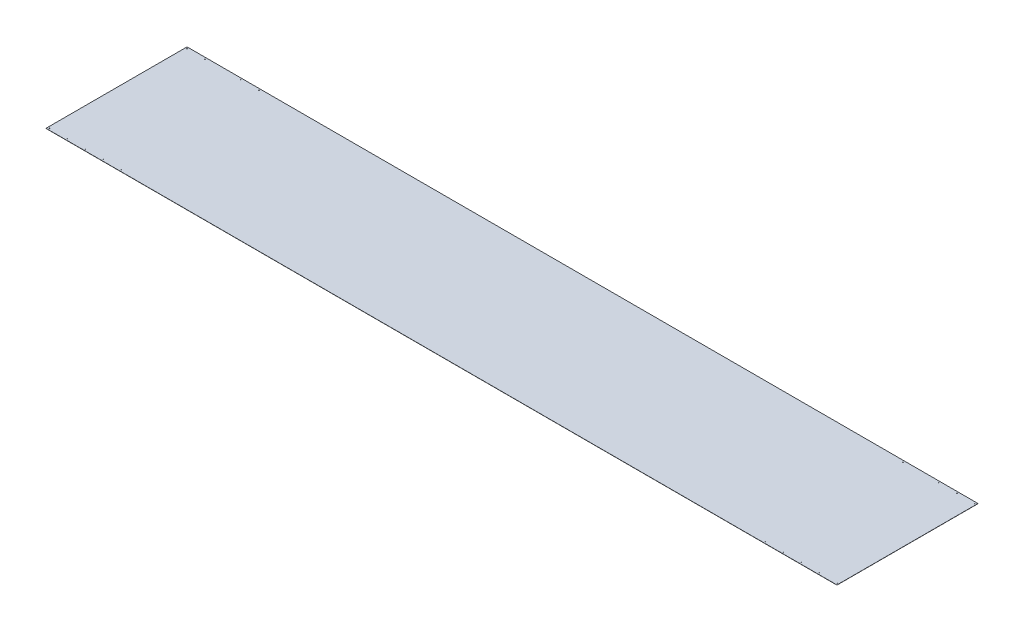
ISO-10303-21;
HEADER;
FILE_DESCRIPTION(('STEP AP214'),'2;1');
FILE_NAME('part.step','',(''),(''),'','','');
FILE_SCHEMA(('AUTOMOTIVE_DESIGN { 1 0 10303 214 1 1 1 1 }'));
ENDSEC;
DATA;
#1=APPLICATION_CONTEXT('core data for automotive mechanical design processes');
#2=APPLICATION_PROTOCOL_DEFINITION('international standard','automotive_design',2000,#1);
#3=PRODUCT_CONTEXT('',#1,'mechanical');
#4=PRODUCT('Part','Part','',(#3));
#5=PRODUCT_RELATED_PRODUCT_CATEGORY('part','',(#4));
#6=PRODUCT_DEFINITION_FORMATION('','',#4);
#7=PRODUCT_DEFINITION_CONTEXT('part definition',#1,'design');
#8=PRODUCT_DEFINITION('design','',#6,#7);
#9=PRODUCT_DEFINITION_SHAPE('','',#8);
#10=(LENGTH_UNIT() NAMED_UNIT(*) SI_UNIT(.MILLI.,.METRE.));
#11=(NAMED_UNIT(*) PLANE_ANGLE_UNIT() SI_UNIT($,.RADIAN.));
#12=(NAMED_UNIT(*) SI_UNIT($,.STERADIAN.) SOLID_ANGLE_UNIT());
#13=UNCERTAINTY_MEASURE_WITH_UNIT(LENGTH_MEASURE(1.E-05),#10,'distance_accuracy_value','');
#14=(GEOMETRIC_REPRESENTATION_CONTEXT(3) GLOBAL_UNCERTAINTY_ASSIGNED_CONTEXT((#13)) GLOBAL_UNIT_ASSIGNED_CONTEXT((#10,
#11,#12)) REPRESENTATION_CONTEXT('',''));
#15=CARTESIAN_POINT('',(0.,0.,0.));
#16=DIRECTION('',(0.,0.,1.));
#17=DIRECTION('',(1.,0.,0.));
#18=AXIS2_PLACEMENT_3D('',#15,#16,#17);
#19=CARTESIAN_POINT('',(-4679.25,2.,834.500000000001));
#20=DIRECTION('',(1.,0.,0.));
#21=DIRECTION('',(0.,0.,-1.));
#22=AXIS2_PLACEMENT_3D('',#19,#20,#21);
#23=PLANE('',#22);
#24=DIRECTION('',(0.,0.,1.));
#25=VECTOR('',#24,1.);
#26=CARTESIAN_POINT('',(-4679.25,0.,834.500000000001));
#27=LINE('',#26,#25);
#28=CARTESIAN_POINT('',(-4679.25,0.,-834.499999999999));
#29=VERTEX_POINT('',#28);
#30=CARTESIAN_POINT('',(-4679.25,0.,834.500000000001));
#31=VERTEX_POINT('',#30);
#32=EDGE_CURVE('E99',#29,#31,#27,.T.);
#33=ORIENTED_EDGE('',*,*,#32,.T.);
#34=DIRECTION('',(0.,-1.,0.));
#35=VECTOR('',#34,1.);
#36=CARTESIAN_POINT('',(-4679.25,2.,834.500000000001));
#37=LINE('',#36,#35);
#38=CARTESIAN_POINT('',(-4679.25,2.,834.500000000001));
#39=VERTEX_POINT('',#38);
#40=EDGE_CURVE('E11',#39,#31,#37,.T.);
#41=ORIENTED_EDGE('',*,*,#40,.F.);
#42=DIRECTION('',(0.,0.,1.));
#43=VECTOR('',#42,1.);
#44=CARTESIAN_POINT('',(-4679.25,2.,834.500000000001));
#45=LINE('',#44,#43);
#46=CARTESIAN_POINT('',(-4679.25,2.,-834.499999999999));
#47=VERTEX_POINT('',#46);
#48=EDGE_CURVE('E86',#47,#39,#45,.T.);
#49=ORIENTED_EDGE('',*,*,#48,.F.);
#50=DIRECTION('',(0.,-1.,0.));
#51=VECTOR('',#50,1.);
#52=CARTESIAN_POINT('',(-4679.25,2.,-834.499999999999));
#53=LINE('',#52,#51);
#54=EDGE_CURVE('E95',#47,#29,#53,.T.);
#55=ORIENTED_EDGE('',*,*,#54,.T.);
#56=EDGE_LOOP('',(#33,#41,#49,#55));
#57=FACE_BOUND('',#56,.T.);
#58=ADVANCED_FACE('F33',(#57),#23,.F.);
#59=CARTESIAN_POINT('',(4679.25,2.,834.5));
#60=DIRECTION('',(0.,0.,-1.));
#61=DIRECTION('',(-1.,0.,0.));
#62=AXIS2_PLACEMENT_3D('',#59,#60,#61);
#63=PLANE('',#62);
#64=DIRECTION('',(1.,0.,0.));
#65=VECTOR('',#64,1.);
#66=CARTESIAN_POINT('',(4679.25,0.,834.5));
#67=LINE('',#66,#65);
#68=CARTESIAN_POINT('',(4679.25,0.,834.5));
#69=VERTEX_POINT('',#68);
#70=EDGE_CURVE('E90',#31,#69,#67,.T.);
#71=ORIENTED_EDGE('',*,*,#70,.T.);
#72=DIRECTION('',(0.,-1.,0.));
#73=VECTOR('',#72,1.);
#74=CARTESIAN_POINT('',(4679.25,2.,834.5));
#75=LINE('',#74,#73);
#76=CARTESIAN_POINT('',(4679.25,2.,834.5));
#77=VERTEX_POINT('',#76);
#78=EDGE_CURVE('E42',#77,#69,#75,.T.);
#79=ORIENTED_EDGE('',*,*,#78,.F.);
#80=DIRECTION('',(1.,0.,0.));
#81=VECTOR('',#80,1.);
#82=CARTESIAN_POINT('',(4679.25,2.,834.5));
#83=LINE('',#82,#81);
#84=EDGE_CURVE('E81',#39,#77,#83,.T.);
#85=ORIENTED_EDGE('',*,*,#84,.F.);
#86=ORIENTED_EDGE('',*,*,#40,.T.);
#87=EDGE_LOOP('',(#71,#79,#85,#86));
#88=FACE_BOUND('',#87,.T.);
#89=ADVANCED_FACE('F89',(#88),#63,.F.);
#90=CARTESIAN_POINT('',(4679.25,2.,834.5));
#91=DIRECTION('',(-1.,0.,0.));
#92=DIRECTION('',(0.,0.,1.));
#93=AXIS2_PLACEMENT_3D('',#90,#91,#92);
#94=PLANE('',#93);
#95=DIRECTION('',(0.,0.,-1.));
#96=VECTOR('',#95,1.);
#97=CARTESIAN_POINT('',(4679.25,0.,834.5));
#98=LINE('',#97,#96);
#99=CARTESIAN_POINT('',(4679.25,0.,-834.5));
#100=VERTEX_POINT('',#99);
#101=EDGE_CURVE('E68',#69,#100,#98,.T.);
#102=ORIENTED_EDGE('',*,*,#101,.T.);
#103=DIRECTION('',(0.,-1.,0.));
#104=VECTOR('',#103,1.);
#105=CARTESIAN_POINT('',(4679.25,2.,-834.5));
#106=LINE('',#105,#104);
#107=CARTESIAN_POINT('',(4679.25,2.,-834.5));
#108=VERTEX_POINT('',#107);
#109=EDGE_CURVE('E91',#108,#100,#106,.T.);
#110=ORIENTED_EDGE('',*,*,#109,.F.);
#111=DIRECTION('',(0.,0.,-1.));
#112=VECTOR('',#111,1.);
#113=CARTESIAN_POINT('',(4679.25,2.,834.5));
#114=LINE('',#113,#112);
#115=EDGE_CURVE('E84',#77,#108,#114,.T.);
#116=ORIENTED_EDGE('',*,*,#115,.F.);
#117=ORIENTED_EDGE('',*,*,#78,.T.);
#118=EDGE_LOOP('',(#102,#110,#116,#117));
#119=FACE_BOUND('',#118,.T.);
#120=ADVANCED_FACE('F93',(#119),#94,.F.);
#121=CARTESIAN_POINT('',(4679.25,2.,-834.5));
#122=DIRECTION('',(0.,0.,1.));
#123=DIRECTION('',(1.,0.,0.));
#124=AXIS2_PLACEMENT_3D('',#121,#122,#123);
#125=PLANE('',#124);
#126=DIRECTION('',(-1.,0.,0.));
#127=VECTOR('',#126,1.);
#128=CARTESIAN_POINT('',(4679.25,0.,-834.5));
#129=LINE('',#128,#127);
#130=EDGE_CURVE('E74',#100,#29,#129,.T.);
#131=ORIENTED_EDGE('',*,*,#130,.T.);
#132=ORIENTED_EDGE('',*,*,#54,.F.);
#133=DIRECTION('',(-1.,0.,0.));
#134=VECTOR('',#133,1.);
#135=CARTESIAN_POINT('',(4679.25,2.,-834.5));
#136=LINE('',#135,#134);
#137=EDGE_CURVE('E51',#108,#47,#136,.T.);
#138=ORIENTED_EDGE('',*,*,#137,.F.);
#139=ORIENTED_EDGE('',*,*,#109,.T.);
#140=EDGE_LOOP('',(#131,#132,#138,#139));
#141=FACE_BOUND('',#140,.T.);
#142=ADVANCED_FACE('F200',(#141),#125,.F.);
#143=CARTESIAN_POINT('',(0.,2.,0.));
#144=DIRECTION('',(0.,1.,0.));
#145=DIRECTION('',(0.,0.,1.));
#146=AXIS2_PLACEMENT_3D('',#143,#144,#145);
#147=PLANE('',#146);
#148=CARTESIAN_POINT('',(4449.75,2.,-814.499999999999));
#149=DIRECTION('',(0.,1.,0.));
#150=DIRECTION('',(0.,0.,1.));
#151=AXIS2_PLACEMENT_3D('',#148,#149,#150);
#152=CIRCLE('',#151,3.24999999999927);
#153=CARTESIAN_POINT('',(4449.75,2.,-811.25));
#154=VERTEX_POINT('',#153);
#155=EDGE_CURVE('E475',#154,#154,#152,.T.);
#156=ORIENTED_EDGE('',*,*,#155,.F.);
#157=EDGE_LOOP('',(#156));
#158=FACE_BOUND('',#157,.T.);
#159=CARTESIAN_POINT('',(4662.25,2.,814.500000000001));
#160=DIRECTION('',(0.,1.,0.));
#161=DIRECTION('',(0.,0.,1.));
#162=AXIS2_PLACEMENT_3D('',#159,#160,#161);
#163=CIRCLE('',#162,3.24999999999927);
#164=CARTESIAN_POINT('',(4662.25,2.,817.75));
#165=VERTEX_POINT('',#164);
#166=EDGE_CURVE('E469',#165,#165,#163,.T.);
#167=ORIENTED_EDGE('',*,*,#166,.F.);
#168=EDGE_LOOP('',(#167));
#169=FACE_BOUND('',#168,.T.);
#170=CARTESIAN_POINT('',(4662.25,2.,-814.5));
#171=DIRECTION('',(0.,1.,0.));
#172=DIRECTION('',(0.,0.,1.));
#173=AXIS2_PLACEMENT_3D('',#170,#171,#172);
#174=CIRCLE('',#173,3.24999999999927);
#175=CARTESIAN_POINT('',(4662.25,2.,-811.250000000001));
#176=VERTEX_POINT('',#175);
#177=EDGE_CURVE('E413',#176,#176,#174,.T.);
#178=ORIENTED_EDGE('',*,*,#177,.F.);
#179=EDGE_LOOP('',(#178));
#180=FACE_BOUND('',#179,.T.);
#181=CARTESIAN_POINT('',(-3809.25,2.,814.500000000001));
#182=DIRECTION('',(0.,1.,0.));
#183=DIRECTION('',(0.,0.,1.));
#184=AXIS2_PLACEMENT_3D('',#181,#182,#183);
#185=CIRCLE('',#184,3.24999999999924);
#186=CARTESIAN_POINT('',(-3809.25,2.,817.75));
#187=VERTEX_POINT('',#186);
#188=EDGE_CURVE('E468',#187,#187,#185,.T.);
#189=ORIENTED_EDGE('',*,*,#188,.F.);
#190=EDGE_LOOP('',(#189));
#191=FACE_BOUND('',#190,.T.);
#192=CARTESIAN_POINT('',(4024.75,2.,-814.499999999996));
#193=DIRECTION('',(0.,1.,0.));
#194=DIRECTION('',(0.,0.,1.));
#195=AXIS2_PLACEMENT_3D('',#192,#193,#194);
#196=CIRCLE('',#195,3.24999999999927);
#197=CARTESIAN_POINT('',(4024.75,2.,-811.249999999997));
#198=VERTEX_POINT('',#197);
#199=EDGE_CURVE('E529',#198,#198,#196,.T.);
#200=ORIENTED_EDGE('',*,*,#199,.F.);
#201=EDGE_LOOP('',(#200));
#202=FACE_BOUND('',#201,.T.);
#203=CARTESIAN_POINT('',(4237.25,2.,814.500000000004));
#204=DIRECTION('',(0.,1.,0.));
#205=DIRECTION('',(0.,0.,1.));
#206=AXIS2_PLACEMENT_3D('',#203,#204,#205);
#207=CIRCLE('',#206,3.24999999999927);
#208=CARTESIAN_POINT('',(4237.25,2.,817.750000000003));
#209=VERTEX_POINT('',#208);
#210=EDGE_CURVE('E532',#209,#209,#207,.T.);
#211=ORIENTED_EDGE('',*,*,#210,.F.);
#212=EDGE_LOOP('',(#211));
#213=FACE_BOUND('',#212,.T.);
#214=CARTESIAN_POINT('',(4237.25,2.,-814.499999999997));
#215=DIRECTION('',(0.,1.,0.));
#216=DIRECTION('',(0.,0.,1.));
#217=AXIS2_PLACEMENT_3D('',#214,#215,#216);
#218=CIRCLE('',#217,3.24999999999927);
#219=CARTESIAN_POINT('',(4237.25,2.,-811.249999999998));
#220=VERTEX_POINT('',#219);
#221=EDGE_CURVE('E538',#220,#220,#218,.T.);
#222=ORIENTED_EDGE('',*,*,#221,.F.);
#223=EDGE_LOOP('',(#222));
#224=FACE_BOUND('',#223,.T.);
#225=CARTESIAN_POINT('',(4449.75,2.,814.500000000002));
#226=DIRECTION('',(0.,1.,0.));
#227=DIRECTION('',(0.,0.,1.));
#228=AXIS2_PLACEMENT_3D('',#225,#226,#227);
#229=CIRCLE('',#228,3.24999999999927);
#230=CARTESIAN_POINT('',(4449.75,2.,817.750000000001));
#231=VERTEX_POINT('',#230);
#232=EDGE_CURVE('E540',#231,#231,#229,.T.);
#233=ORIENTED_EDGE('',*,*,#232,.F.);
#234=EDGE_LOOP('',(#233));
#235=FACE_BOUND('',#234,.T.);
#236=CARTESIAN_POINT('',(-4234.25,2.,-814.5));
#237=DIRECTION('',(0.,1.,0.));
#238=DIRECTION('',(0.,0.,1.));
#239=AXIS2_PLACEMENT_3D('',#236,#237,#238);
#240=CIRCLE('',#239,3.24999999999927);
#241=CARTESIAN_POINT('',(-4234.25,2.,-811.250000000001));
#242=VERTEX_POINT('',#241);
#243=EDGE_CURVE('E488',#242,#242,#240,.T.);
#244=ORIENTED_EDGE('',*,*,#243,.F.);
#245=EDGE_LOOP('',(#244));
#246=FACE_BOUND('',#245,.T.);
#247=CARTESIAN_POINT('',(-4446.75,2.,814.500000000001));
#248=DIRECTION('',(0.,1.,0.));
#249=DIRECTION('',(0.,0.,1.));
#250=AXIS2_PLACEMENT_3D('',#247,#248,#249);
#251=CIRCLE('',#250,3.24999999999927);
#252=CARTESIAN_POINT('',(-4446.75,2.,817.75));
#253=VERTEX_POINT('',#252);
#254=EDGE_CURVE('E491',#253,#253,#251,.T.);
#255=ORIENTED_EDGE('',*,*,#254,.F.);
#256=EDGE_LOOP('',(#255));
#257=FACE_BOUND('',#256,.T.);
#258=CARTESIAN_POINT('',(-4446.75,2.,-814.5));
#259=DIRECTION('',(0.,1.,0.));
#260=DIRECTION('',(0.,0.,1.));
#261=AXIS2_PLACEMENT_3D('',#258,#259,#260);
#262=CIRCLE('',#261,3.24999999999927);
#263=CARTESIAN_POINT('',(-4446.75,2.,-811.250000000001));
#264=VERTEX_POINT('',#263);
#265=EDGE_CURVE('E494',#264,#264,#262,.T.);
#266=ORIENTED_EDGE('',*,*,#265,.F.);
#267=EDGE_LOOP('',(#266));
#268=FACE_BOUND('',#267,.T.);
#269=CARTESIAN_POINT('',(-4659.25,2.,814.500000000001));
#270=DIRECTION('',(0.,1.,0.));
#271=DIRECTION('',(0.,0.,1.));
#272=AXIS2_PLACEMENT_3D('',#269,#270,#271);
#273=CIRCLE('',#272,3.24999999999927);
#274=CARTESIAN_POINT('',(-4659.25,2.,817.75));
#275=VERTEX_POINT('',#274);
#276=EDGE_CURVE('E497',#275,#275,#273,.T.);
#277=ORIENTED_EDGE('',*,*,#276,.F.);
#278=EDGE_LOOP('',(#277));
#279=FACE_BOUND('',#278,.T.);
#280=CARTESIAN_POINT('',(-3809.25,2.,-814.5));
#281=DIRECTION('',(0.,1.,0.));
#282=DIRECTION('',(0.,0.,1.));
#283=AXIS2_PLACEMENT_3D('',#280,#281,#282);
#284=CIRCLE('',#283,3.24999999999924);
#285=CARTESIAN_POINT('',(-3809.25,2.,-811.250000000001));
#286=VERTEX_POINT('',#285);
#287=EDGE_CURVE('E472',#286,#286,#284,.T.);
#288=ORIENTED_EDGE('',*,*,#287,.F.);
#289=EDGE_LOOP('',(#288));
#290=FACE_BOUND('',#289,.T.);
#291=CARTESIAN_POINT('',(-4021.75,2.,814.500000000001));
#292=DIRECTION('',(0.,1.,0.));
#293=DIRECTION('',(0.,0.,1.));
#294=AXIS2_PLACEMENT_3D('',#291,#292,#293);
#295=CIRCLE('',#294,3.24999999999927);
#296=CARTESIAN_POINT('',(-4021.75,2.,817.75));
#297=VERTEX_POINT('',#296);
#298=EDGE_CURVE('E479',#297,#297,#295,.T.);
#299=ORIENTED_EDGE('',*,*,#298,.F.);
#300=EDGE_LOOP('',(#299));
#301=FACE_BOUND('',#300,.T.);
#302=CARTESIAN_POINT('',(-4021.75,2.,-814.5));
#303=DIRECTION('',(0.,1.,0.));
#304=DIRECTION('',(0.,0.,1.));
#305=AXIS2_PLACEMENT_3D('',#302,#303,#304);
#306=CIRCLE('',#305,3.24999999999927);
#307=CARTESIAN_POINT('',(-4021.75,2.,-811.250000000001));
#308=VERTEX_POINT('',#307);
#309=EDGE_CURVE('E482',#308,#308,#306,.T.);
#310=ORIENTED_EDGE('',*,*,#309,.F.);
#311=EDGE_LOOP('',(#310));
#312=FACE_BOUND('',#311,.T.);
#313=CARTESIAN_POINT('',(-4234.25,2.,814.500000000001));
#314=DIRECTION('',(0.,1.,0.));
#315=DIRECTION('',(0.,0.,1.));
#316=AXIS2_PLACEMENT_3D('',#313,#314,#315);
#317=CIRCLE('',#316,3.24999999999927);
#318=CARTESIAN_POINT('',(-4234.25,2.,817.75));
#319=VERTEX_POINT('',#318);
#320=EDGE_CURVE('E485',#319,#319,#317,.T.);
#321=ORIENTED_EDGE('',*,*,#320,.F.);
#322=EDGE_LOOP('',(#321));
#323=FACE_BOUND('',#322,.T.);
#324=CARTESIAN_POINT('',(3812.25,2.,814.500000000007));
#325=DIRECTION('',(0.,1.,0.));
#326=DIRECTION('',(0.,0.,1.));
#327=AXIS2_PLACEMENT_3D('',#324,#325,#326);
#328=CIRCLE('',#327,3.24999999999924);
#329=CARTESIAN_POINT('',(3812.25,2.,817.750000000006));
#330=VERTEX_POINT('',#329);
#331=EDGE_CURVE('E521',#330,#330,#328,.T.);
#332=ORIENTED_EDGE('',*,*,#331,.F.);
#333=EDGE_LOOP('',(#332));
#334=FACE_BOUND('',#333,.T.);
#335=CARTESIAN_POINT('',(3812.25,2.,-814.499999999995));
#336=DIRECTION('',(0.,1.,0.));
#337=DIRECTION('',(0.,0.,1.));
#338=AXIS2_PLACEMENT_3D('',#335,#336,#337);
#339=CIRCLE('',#338,3.24999999999924);
#340=CARTESIAN_POINT('',(3812.25,2.,-811.249999999995));
#341=VERTEX_POINT('',#340);
#342=EDGE_CURVE('E525',#341,#341,#339,.T.);
#343=ORIENTED_EDGE('',*,*,#342,.F.);
#344=EDGE_LOOP('',(#343));
#345=FACE_BOUND('',#344,.T.);
#346=CARTESIAN_POINT('',(4024.75,2.,814.500000000005));
#347=DIRECTION('',(0.,1.,0.));
#348=DIRECTION('',(0.,0.,1.));
#349=AXIS2_PLACEMENT_3D('',#346,#347,#348);
#350=CIRCLE('',#349,3.24999999999927);
#351=CARTESIAN_POINT('',(4024.75,2.,817.750000000004));
#352=VERTEX_POINT('',#351);
#353=EDGE_CURVE('E528',#352,#352,#350,.T.);
#354=ORIENTED_EDGE('',*,*,#353,.F.);
#355=EDGE_LOOP('',(#354));
#356=FACE_BOUND('',#355,.T.);
#357=CARTESIAN_POINT('',(-4659.25,2.,-814.5));
#358=DIRECTION('',(0.,1.,0.));
#359=DIRECTION('',(0.,0.,1.));
#360=AXIS2_PLACEMENT_3D('',#357,#358,#359);
#361=CIRCLE('',#360,3.24999999999927);
#362=CARTESIAN_POINT('',(-4659.25,2.,-811.250000000001));
#363=VERTEX_POINT('',#362);
#364=EDGE_CURVE('E111',#363,#363,#361,.T.);
#365=ORIENTED_EDGE('',*,*,#364,.F.);
#366=EDGE_LOOP('',(#365));
#367=FACE_BOUND('',#366,.T.);
#368=ORIENTED_EDGE('',*,*,#48,.T.);
#369=ORIENTED_EDGE('',*,*,#84,.T.);
#370=ORIENTED_EDGE('',*,*,#115,.T.);
#371=ORIENTED_EDGE('',*,*,#137,.T.);
#372=EDGE_LOOP('',(#368,#369,#370,#371));
#373=FACE_BOUND('',#372,.T.);
#374=ADVANCED_FACE('F82',(#158,#169,#180,#191,#202,#213,#224,#235,#246,#257,#268,#279,#290,#301,
#312,#323,#334,#345,#356,#367,#373),#147,.T.);
#375=CARTESIAN_POINT('',(0.,0.,0.));
#376=DIRECTION('',(0.,1.,0.));
#377=DIRECTION('',(0.,0.,1.));
#378=AXIS2_PLACEMENT_3D('',#375,#376,#377);
#379=PLANE('',#378);
#380=CARTESIAN_POINT('',(4449.75,0.,-814.499999999999));
#381=DIRECTION('',(0.,1.,0.));
#382=DIRECTION('',(0.,0.,1.));
#383=AXIS2_PLACEMENT_3D('',#380,#381,#382);
#384=CIRCLE('',#383,3.24999999999927);
#385=CARTESIAN_POINT('',(4449.75,0.,-811.25));
#386=VERTEX_POINT('',#385);
#387=EDGE_CURVE('E36',#386,#386,#384,.T.);
#388=ORIENTED_EDGE('',*,*,#387,.T.);
#389=EDGE_LOOP('',(#388));
#390=FACE_BOUND('',#389,.T.);
#391=CARTESIAN_POINT('',(4662.25,0.,814.500000000001));
#392=DIRECTION('',(0.,1.,0.));
#393=DIRECTION('',(0.,0.,1.));
#394=AXIS2_PLACEMENT_3D('',#391,#392,#393);
#395=CIRCLE('',#394,3.24999999999927);
#396=CARTESIAN_POINT('',(4662.25,0.,817.75));
#397=VERTEX_POINT('',#396);
#398=EDGE_CURVE('E161',#397,#397,#395,.T.);
#399=ORIENTED_EDGE('',*,*,#398,.T.);
#400=EDGE_LOOP('',(#399));
#401=FACE_BOUND('',#400,.T.);
#402=CARTESIAN_POINT('',(4662.25,0.,-814.5));
#403=DIRECTION('',(0.,1.,0.));
#404=DIRECTION('',(0.,0.,1.));
#405=AXIS2_PLACEMENT_3D('',#402,#403,#404);
#406=CIRCLE('',#405,3.24999999999927);
#407=CARTESIAN_POINT('',(4662.25,0.,-811.250000000001));
#408=VERTEX_POINT('',#407);
#409=EDGE_CURVE('E159',#408,#408,#406,.T.);
#410=ORIENTED_EDGE('',*,*,#409,.T.);
#411=EDGE_LOOP('',(#410));
#412=FACE_BOUND('',#411,.T.);
#413=CARTESIAN_POINT('',(-3809.25,0.,814.500000000001));
#414=DIRECTION('',(0.,1.,0.));
#415=DIRECTION('',(0.,0.,1.));
#416=AXIS2_PLACEMENT_3D('',#413,#414,#415);
#417=CIRCLE('',#416,3.24999999999924);
#418=CARTESIAN_POINT('',(-3809.25,0.,817.75));
#419=VERTEX_POINT('',#418);
#420=EDGE_CURVE('E156',#419,#419,#417,.T.);
#421=ORIENTED_EDGE('',*,*,#420,.T.);
#422=EDGE_LOOP('',(#421));
#423=FACE_BOUND('',#422,.T.);
#424=CARTESIAN_POINT('',(4024.75,0.,-814.499999999996));
#425=DIRECTION('',(0.,1.,0.));
#426=DIRECTION('',(0.,0.,1.));
#427=AXIS2_PLACEMENT_3D('',#424,#425,#426);
#428=CIRCLE('',#427,3.24999999999927);
#429=CARTESIAN_POINT('',(4024.75,0.,-811.249999999997));
#430=VERTEX_POINT('',#429);
#431=EDGE_CURVE('E153',#430,#430,#428,.T.);
#432=ORIENTED_EDGE('',*,*,#431,.T.);
#433=EDGE_LOOP('',(#432));
#434=FACE_BOUND('',#433,.T.);
#435=CARTESIAN_POINT('',(4237.25,0.,814.500000000004));
#436=DIRECTION('',(0.,1.,0.));
#437=DIRECTION('',(0.,0.,1.));
#438=AXIS2_PLACEMENT_3D('',#435,#436,#437);
#439=CIRCLE('',#438,3.24999999999927);
#440=CARTESIAN_POINT('',(4237.25,0.,817.750000000003));
#441=VERTEX_POINT('',#440);
#442=EDGE_CURVE('E150',#441,#441,#439,.T.);
#443=ORIENTED_EDGE('',*,*,#442,.T.);
#444=EDGE_LOOP('',(#443));
#445=FACE_BOUND('',#444,.T.);
#446=CARTESIAN_POINT('',(4237.25,0.,-814.499999999997));
#447=DIRECTION('',(0.,1.,0.));
#448=DIRECTION('',(0.,0.,1.));
#449=AXIS2_PLACEMENT_3D('',#446,#447,#448);
#450=CIRCLE('',#449,3.24999999999927);
#451=CARTESIAN_POINT('',(4237.25,0.,-811.249999999998));
#452=VERTEX_POINT('',#451);
#453=EDGE_CURVE('E147',#452,#452,#450,.T.);
#454=ORIENTED_EDGE('',*,*,#453,.T.);
#455=EDGE_LOOP('',(#454));
#456=FACE_BOUND('',#455,.T.);
#457=CARTESIAN_POINT('',(4449.75,0.,814.500000000002));
#458=DIRECTION('',(0.,1.,0.));
#459=DIRECTION('',(0.,0.,1.));
#460=AXIS2_PLACEMENT_3D('',#457,#458,#459);
#461=CIRCLE('',#460,3.24999999999927);
#462=CARTESIAN_POINT('',(4449.75,0.,817.750000000001));
#463=VERTEX_POINT('',#462);
#464=EDGE_CURVE('E144',#463,#463,#461,.T.);
#465=ORIENTED_EDGE('',*,*,#464,.T.);
#466=EDGE_LOOP('',(#465));
#467=FACE_BOUND('',#466,.T.);
#468=CARTESIAN_POINT('',(-4234.25,0.,-814.5));
#469=DIRECTION('',(0.,1.,0.));
#470=DIRECTION('',(0.,0.,1.));
#471=AXIS2_PLACEMENT_3D('',#468,#469,#470);
#472=CIRCLE('',#471,3.24999999999927);
#473=CARTESIAN_POINT('',(-4234.25,0.,-811.250000000001));
#474=VERTEX_POINT('',#473);
#475=EDGE_CURVE('E141',#474,#474,#472,.T.);
#476=ORIENTED_EDGE('',*,*,#475,.T.);
#477=EDGE_LOOP('',(#476));
#478=FACE_BOUND('',#477,.T.);
#479=CARTESIAN_POINT('',(-4446.75,0.,814.500000000001));
#480=DIRECTION('',(0.,1.,0.));
#481=DIRECTION('',(0.,0.,1.));
#482=AXIS2_PLACEMENT_3D('',#479,#480,#481);
#483=CIRCLE('',#482,3.24999999999927);
#484=CARTESIAN_POINT('',(-4446.75,0.,817.75));
#485=VERTEX_POINT('',#484);
#486=EDGE_CURVE('E138',#485,#485,#483,.T.);
#487=ORIENTED_EDGE('',*,*,#486,.T.);
#488=EDGE_LOOP('',(#487));
#489=FACE_BOUND('',#488,.T.);
#490=CARTESIAN_POINT('',(-4446.75,0.,-814.5));
#491=DIRECTION('',(0.,1.,0.));
#492=DIRECTION('',(0.,0.,1.));
#493=AXIS2_PLACEMENT_3D('',#490,#491,#492);
#494=CIRCLE('',#493,3.24999999999927);
#495=CARTESIAN_POINT('',(-4446.75,0.,-811.250000000001));
#496=VERTEX_POINT('',#495);
#497=EDGE_CURVE('E135',#496,#496,#494,.T.);
#498=ORIENTED_EDGE('',*,*,#497,.T.);
#499=EDGE_LOOP('',(#498));
#500=FACE_BOUND('',#499,.T.);
#501=CARTESIAN_POINT('',(-4659.25,0.,814.500000000001));
#502=DIRECTION('',(0.,1.,0.));
#503=DIRECTION('',(0.,0.,1.));
#504=AXIS2_PLACEMENT_3D('',#501,#502,#503);
#505=CIRCLE('',#504,3.24999999999927);
#506=CARTESIAN_POINT('',(-4659.25,0.,817.75));
#507=VERTEX_POINT('',#506);
#508=EDGE_CURVE('E132',#507,#507,#505,.T.);
#509=ORIENTED_EDGE('',*,*,#508,.T.);
#510=EDGE_LOOP('',(#509));
#511=FACE_BOUND('',#510,.T.);
#512=CARTESIAN_POINT('',(-3809.25,0.,-814.5));
#513=DIRECTION('',(0.,1.,0.));
#514=DIRECTION('',(0.,0.,1.));
#515=AXIS2_PLACEMENT_3D('',#512,#513,#514);
#516=CIRCLE('',#515,3.24999999999924);
#517=CARTESIAN_POINT('',(-3809.25,0.,-811.250000000001));
#518=VERTEX_POINT('',#517);
#519=EDGE_CURVE('E129',#518,#518,#516,.T.);
#520=ORIENTED_EDGE('',*,*,#519,.T.);
#521=EDGE_LOOP('',(#520));
#522=FACE_BOUND('',#521,.T.);
#523=CARTESIAN_POINT('',(-4021.75,0.,814.500000000001));
#524=DIRECTION('',(0.,1.,0.));
#525=DIRECTION('',(0.,0.,1.));
#526=AXIS2_PLACEMENT_3D('',#523,#524,#525);
#527=CIRCLE('',#526,3.24999999999927);
#528=CARTESIAN_POINT('',(-4021.75,0.,817.75));
#529=VERTEX_POINT('',#528);
#530=EDGE_CURVE('E126',#529,#529,#527,.T.);
#531=ORIENTED_EDGE('',*,*,#530,.T.);
#532=EDGE_LOOP('',(#531));
#533=FACE_BOUND('',#532,.T.);
#534=CARTESIAN_POINT('',(-4021.75,0.,-814.5));
#535=DIRECTION('',(0.,1.,0.));
#536=DIRECTION('',(0.,0.,1.));
#537=AXIS2_PLACEMENT_3D('',#534,#535,#536);
#538=CIRCLE('',#537,3.24999999999927);
#539=CARTESIAN_POINT('',(-4021.75,0.,-811.250000000001));
#540=VERTEX_POINT('',#539);
#541=EDGE_CURVE('E123',#540,#540,#538,.T.);
#542=ORIENTED_EDGE('',*,*,#541,.T.);
#543=EDGE_LOOP('',(#542));
#544=FACE_BOUND('',#543,.T.);
#545=CARTESIAN_POINT('',(-4234.25,0.,814.500000000001));
#546=DIRECTION('',(0.,1.,0.));
#547=DIRECTION('',(0.,0.,1.));
#548=AXIS2_PLACEMENT_3D('',#545,#546,#547);
#549=CIRCLE('',#548,3.24999999999927);
#550=CARTESIAN_POINT('',(-4234.25,0.,817.75));
#551=VERTEX_POINT('',#550);
#552=EDGE_CURVE('E120',#551,#551,#549,.T.);
#553=ORIENTED_EDGE('',*,*,#552,.T.);
#554=EDGE_LOOP('',(#553));
#555=FACE_BOUND('',#554,.T.);
#556=CARTESIAN_POINT('',(3812.25,0.,814.500000000007));
#557=DIRECTION('',(0.,1.,0.));
#558=DIRECTION('',(0.,0.,1.));
#559=AXIS2_PLACEMENT_3D('',#556,#557,#558);
#560=CIRCLE('',#559,3.24999999999924);
#561=CARTESIAN_POINT('',(3812.25,0.,817.750000000006));
#562=VERTEX_POINT('',#561);
#563=EDGE_CURVE('E117',#562,#562,#560,.T.);
#564=ORIENTED_EDGE('',*,*,#563,.T.);
#565=EDGE_LOOP('',(#564));
#566=FACE_BOUND('',#565,.T.);
#567=CARTESIAN_POINT('',(3812.25,0.,-814.499999999995));
#568=DIRECTION('',(0.,1.,0.));
#569=DIRECTION('',(0.,0.,1.));
#570=AXIS2_PLACEMENT_3D('',#567,#568,#569);
#571=CIRCLE('',#570,3.24999999999924);
#572=CARTESIAN_POINT('',(3812.25,0.,-811.249999999995));
#573=VERTEX_POINT('',#572);
#574=EDGE_CURVE('E114',#573,#573,#571,.T.);
#575=ORIENTED_EDGE('',*,*,#574,.T.);
#576=EDGE_LOOP('',(#575));
#577=FACE_BOUND('',#576,.T.);
#578=CARTESIAN_POINT('',(4024.75,0.,814.500000000005));
#579=DIRECTION('',(0.,1.,0.));
#580=DIRECTION('',(0.,0.,1.));
#581=AXIS2_PLACEMENT_3D('',#578,#579,#580);
#582=CIRCLE('',#581,3.24999999999927);
#583=CARTESIAN_POINT('',(4024.75,0.,817.750000000004));
#584=VERTEX_POINT('',#583);
#585=EDGE_CURVE('E110',#584,#584,#582,.T.);
#586=ORIENTED_EDGE('',*,*,#585,.T.);
#587=EDGE_LOOP('',(#586));
#588=FACE_BOUND('',#587,.T.);
#589=CARTESIAN_POINT('',(-4659.25,0.,-814.5));
#590=DIRECTION('',(0.,1.,0.));
#591=DIRECTION('',(0.,0.,1.));
#592=AXIS2_PLACEMENT_3D('',#589,#590,#591);
#593=CIRCLE('',#592,3.24999999999927);
#594=CARTESIAN_POINT('',(-4659.25,0.,-811.250000000001));
#595=VERTEX_POINT('',#594);
#596=EDGE_CURVE('E107',#595,#595,#593,.T.);
#597=ORIENTED_EDGE('',*,*,#596,.T.);
#598=EDGE_LOOP('',(#597));
#599=FACE_BOUND('',#598,.T.);
#600=ORIENTED_EDGE('',*,*,#32,.F.);
#601=ORIENTED_EDGE('',*,*,#130,.F.);
#602=ORIENTED_EDGE('',*,*,#101,.F.);
#603=ORIENTED_EDGE('',*,*,#70,.F.);
#604=EDGE_LOOP('',(#600,#601,#602,#603));
#605=FACE_BOUND('',#604,.T.);
#606=ADVANCED_FACE('F168',(#390,#401,#412,#423,#434,#445,#456,#467,#478,#489,#500,#511,#522,
#533,#544,#555,#566,#577,#588,#599,#605),#379,.F.);
#607=CARTESIAN_POINT('',(-4659.25,-8.,-814.5));
#608=DIRECTION('',(0.,1.,0.));
#609=DIRECTION('',(0.,0.,1.));
#610=AXIS2_PLACEMENT_3D('',#607,#608,#609);
#611=CYLINDRICAL_SURFACE('',#610,3.24999999999927);
#612=ORIENTED_EDGE('',*,*,#364,.T.);
#613=EDGE_LOOP('',(#612));
#614=FACE_BOUND('',#613,.T.);
#615=ORIENTED_EDGE('',*,*,#596,.F.);
#616=EDGE_LOOP('',(#615));
#617=FACE_BOUND('',#616,.T.);
#618=ADVANCED_FACE('F191',(#614,#617),#611,.F.);
#619=CARTESIAN_POINT('',(4024.75,-8.,814.500000000005));
#620=DIRECTION('',(0.,1.,0.));
#621=DIRECTION('',(0.,0.,1.));
#622=AXIS2_PLACEMENT_3D('',#619,#620,#621);
#623=CYLINDRICAL_SURFACE('',#622,3.24999999999927);
#624=ORIENTED_EDGE('',*,*,#353,.T.);
#625=EDGE_LOOP('',(#624));
#626=FACE_BOUND('',#625,.T.);
#627=ORIENTED_EDGE('',*,*,#585,.F.);
#628=EDGE_LOOP('',(#627));
#629=FACE_BOUND('',#628,.T.);
#630=ADVANCED_FACE('F197',(#626,#629),#623,.F.);
#631=CARTESIAN_POINT('',(3812.25,-8.,-814.499999999995));
#632=DIRECTION('',(0.,1.,0.));
#633=DIRECTION('',(0.,0.,1.));
#634=AXIS2_PLACEMENT_3D('',#631,#632,#633);
#635=CYLINDRICAL_SURFACE('',#634,3.24999999999924);
#636=ORIENTED_EDGE('',*,*,#342,.T.);
#637=EDGE_LOOP('',(#636));
#638=FACE_BOUND('',#637,.T.);
#639=ORIENTED_EDGE('',*,*,#574,.F.);
#640=EDGE_LOOP('',(#639));
#641=FACE_BOUND('',#640,.T.);
#642=ADVANCED_FACE('F238',(#638,#641),#635,.F.);
#643=CARTESIAN_POINT('',(3812.25,-8.,814.500000000007));
#644=DIRECTION('',(0.,1.,0.));
#645=DIRECTION('',(0.,0.,1.));
#646=AXIS2_PLACEMENT_3D('',#643,#644,#645);
#647=CYLINDRICAL_SURFACE('',#646,3.24999999999924);
#648=ORIENTED_EDGE('',*,*,#331,.T.);
#649=EDGE_LOOP('',(#648));
#650=FACE_BOUND('',#649,.T.);
#651=ORIENTED_EDGE('',*,*,#563,.F.);
#652=EDGE_LOOP('',(#651));
#653=FACE_BOUND('',#652,.T.);
#654=ADVANCED_FACE('F248',(#650,#653),#647,.F.);
#655=CARTESIAN_POINT('',(-4234.25,-8.,814.500000000001));
#656=DIRECTION('',(0.,1.,0.));
#657=DIRECTION('',(0.,0.,1.));
#658=AXIS2_PLACEMENT_3D('',#655,#656,#657);
#659=CYLINDRICAL_SURFACE('',#658,3.24999999999927);
#660=ORIENTED_EDGE('',*,*,#320,.T.);
#661=EDGE_LOOP('',(#660));
#662=FACE_BOUND('',#661,.T.);
#663=ORIENTED_EDGE('',*,*,#552,.F.);
#664=EDGE_LOOP('',(#663));
#665=FACE_BOUND('',#664,.T.);
#666=ADVANCED_FACE('F258',(#662,#665),#659,.F.);
#667=CARTESIAN_POINT('',(-4021.75,-8.,-814.5));
#668=DIRECTION('',(0.,1.,0.));
#669=DIRECTION('',(0.,0.,1.));
#670=AXIS2_PLACEMENT_3D('',#667,#668,#669);
#671=CYLINDRICAL_SURFACE('',#670,3.24999999999927);
#672=ORIENTED_EDGE('',*,*,#309,.T.);
#673=EDGE_LOOP('',(#672));
#674=FACE_BOUND('',#673,.T.);
#675=ORIENTED_EDGE('',*,*,#541,.F.);
#676=EDGE_LOOP('',(#675));
#677=FACE_BOUND('',#676,.T.);
#678=ADVANCED_FACE('F268',(#674,#677),#671,.F.);
#679=CARTESIAN_POINT('',(-4021.75,-8.,814.500000000001));
#680=DIRECTION('',(0.,1.,0.));
#681=DIRECTION('',(0.,0.,1.));
#682=AXIS2_PLACEMENT_3D('',#679,#680,#681);
#683=CYLINDRICAL_SURFACE('',#682,3.24999999999927);
#684=ORIENTED_EDGE('',*,*,#298,.T.);
#685=EDGE_LOOP('',(#684));
#686=FACE_BOUND('',#685,.T.);
#687=ORIENTED_EDGE('',*,*,#530,.F.);
#688=EDGE_LOOP('',(#687));
#689=FACE_BOUND('',#688,.T.);
#690=ADVANCED_FACE('F278',(#686,#689),#683,.F.);
#691=CARTESIAN_POINT('',(-3809.25,-8.,-814.5));
#692=DIRECTION('',(0.,1.,0.));
#693=DIRECTION('',(0.,0.,1.));
#694=AXIS2_PLACEMENT_3D('',#691,#692,#693);
#695=CYLINDRICAL_SURFACE('',#694,3.24999999999924);
#696=ORIENTED_EDGE('',*,*,#287,.T.);
#697=EDGE_LOOP('',(#696));
#698=FACE_BOUND('',#697,.T.);
#699=ORIENTED_EDGE('',*,*,#519,.F.);
#700=EDGE_LOOP('',(#699));
#701=FACE_BOUND('',#700,.T.);
#702=ADVANCED_FACE('F288',(#698,#701),#695,.F.);
#703=CARTESIAN_POINT('',(-4659.25,-8.,814.500000000001));
#704=DIRECTION('',(0.,1.,0.));
#705=DIRECTION('',(0.,0.,1.));
#706=AXIS2_PLACEMENT_3D('',#703,#704,#705);
#707=CYLINDRICAL_SURFACE('',#706,3.24999999999927);
#708=ORIENTED_EDGE('',*,*,#276,.T.);
#709=EDGE_LOOP('',(#708));
#710=FACE_BOUND('',#709,.T.);
#711=ORIENTED_EDGE('',*,*,#508,.F.);
#712=EDGE_LOOP('',(#711));
#713=FACE_BOUND('',#712,.T.);
#714=ADVANCED_FACE('F298',(#710,#713),#707,.F.);
#715=CARTESIAN_POINT('',(-4446.75,-8.,-814.5));
#716=DIRECTION('',(0.,1.,0.));
#717=DIRECTION('',(0.,0.,1.));
#718=AXIS2_PLACEMENT_3D('',#715,#716,#717);
#719=CYLINDRICAL_SURFACE('',#718,3.24999999999927);
#720=ORIENTED_EDGE('',*,*,#265,.T.);
#721=EDGE_LOOP('',(#720));
#722=FACE_BOUND('',#721,.T.);
#723=ORIENTED_EDGE('',*,*,#497,.F.);
#724=EDGE_LOOP('',(#723));
#725=FACE_BOUND('',#724,.T.);
#726=ADVANCED_FACE('F308',(#722,#725),#719,.F.);
#727=CARTESIAN_POINT('',(-4446.75,-8.,814.500000000001));
#728=DIRECTION('',(0.,1.,0.));
#729=DIRECTION('',(0.,0.,1.));
#730=AXIS2_PLACEMENT_3D('',#727,#728,#729);
#731=CYLINDRICAL_SURFACE('',#730,3.24999999999927);
#732=ORIENTED_EDGE('',*,*,#254,.T.);
#733=EDGE_LOOP('',(#732));
#734=FACE_BOUND('',#733,.T.);
#735=ORIENTED_EDGE('',*,*,#486,.F.);
#736=EDGE_LOOP('',(#735));
#737=FACE_BOUND('',#736,.T.);
#738=ADVANCED_FACE('F318',(#734,#737),#731,.F.);
#739=CARTESIAN_POINT('',(-4234.25,-8.,-814.5));
#740=DIRECTION('',(0.,1.,0.));
#741=DIRECTION('',(0.,0.,1.));
#742=AXIS2_PLACEMENT_3D('',#739,#740,#741);
#743=CYLINDRICAL_SURFACE('',#742,3.24999999999927);
#744=ORIENTED_EDGE('',*,*,#243,.T.);
#745=EDGE_LOOP('',(#744));
#746=FACE_BOUND('',#745,.T.);
#747=ORIENTED_EDGE('',*,*,#475,.F.);
#748=EDGE_LOOP('',(#747));
#749=FACE_BOUND('',#748,.T.);
#750=ADVANCED_FACE('F328',(#746,#749),#743,.F.);
#751=CARTESIAN_POINT('',(4449.75,-8.,814.500000000002));
#752=DIRECTION('',(0.,1.,0.));
#753=DIRECTION('',(0.,0.,1.));
#754=AXIS2_PLACEMENT_3D('',#751,#752,#753);
#755=CYLINDRICAL_SURFACE('',#754,3.24999999999927);
#756=ORIENTED_EDGE('',*,*,#232,.T.);
#757=EDGE_LOOP('',(#756));
#758=FACE_BOUND('',#757,.T.);
#759=ORIENTED_EDGE('',*,*,#464,.F.);
#760=EDGE_LOOP('',(#759));
#761=FACE_BOUND('',#760,.T.);
#762=ADVANCED_FACE('F338',(#758,#761),#755,.F.);
#763=CARTESIAN_POINT('',(4237.25,-8.,-814.499999999997));
#764=DIRECTION('',(0.,1.,0.));
#765=DIRECTION('',(0.,0.,1.));
#766=AXIS2_PLACEMENT_3D('',#763,#764,#765);
#767=CYLINDRICAL_SURFACE('',#766,3.24999999999927);
#768=ORIENTED_EDGE('',*,*,#221,.T.);
#769=EDGE_LOOP('',(#768));
#770=FACE_BOUND('',#769,.T.);
#771=ORIENTED_EDGE('',*,*,#453,.F.);
#772=EDGE_LOOP('',(#771));
#773=FACE_BOUND('',#772,.T.);
#774=ADVANCED_FACE('F348',(#770,#773),#767,.F.);
#775=CARTESIAN_POINT('',(4237.25,-8.,814.500000000004));
#776=DIRECTION('',(0.,1.,0.));
#777=DIRECTION('',(0.,0.,1.));
#778=AXIS2_PLACEMENT_3D('',#775,#776,#777);
#779=CYLINDRICAL_SURFACE('',#778,3.24999999999927);
#780=ORIENTED_EDGE('',*,*,#210,.T.);
#781=EDGE_LOOP('',(#780));
#782=FACE_BOUND('',#781,.T.);
#783=ORIENTED_EDGE('',*,*,#442,.F.);
#784=EDGE_LOOP('',(#783));
#785=FACE_BOUND('',#784,.T.);
#786=ADVANCED_FACE('F358',(#782,#785),#779,.F.);
#787=CARTESIAN_POINT('',(4024.75,-8.,-814.499999999996));
#788=DIRECTION('',(0.,1.,0.));
#789=DIRECTION('',(0.,0.,1.));
#790=AXIS2_PLACEMENT_3D('',#787,#788,#789);
#791=CYLINDRICAL_SURFACE('',#790,3.24999999999927);
#792=ORIENTED_EDGE('',*,*,#199,.T.);
#793=EDGE_LOOP('',(#792));
#794=FACE_BOUND('',#793,.T.);
#795=ORIENTED_EDGE('',*,*,#431,.F.);
#796=EDGE_LOOP('',(#795));
#797=FACE_BOUND('',#796,.T.);
#798=ADVANCED_FACE('F368',(#794,#797),#791,.F.);
#799=CARTESIAN_POINT('',(-3809.25,-8.,814.500000000001));
#800=DIRECTION('',(0.,1.,0.));
#801=DIRECTION('',(0.,0.,1.));
#802=AXIS2_PLACEMENT_3D('',#799,#800,#801);
#803=CYLINDRICAL_SURFACE('',#802,3.24999999999924);
#804=ORIENTED_EDGE('',*,*,#188,.T.);
#805=EDGE_LOOP('',(#804));
#806=FACE_BOUND('',#805,.T.);
#807=ORIENTED_EDGE('',*,*,#420,.F.);
#808=EDGE_LOOP('',(#807));
#809=FACE_BOUND('',#808,.T.);
#810=ADVANCED_FACE('F378',(#806,#809),#803,.F.);
#811=CARTESIAN_POINT('',(4662.25,-8.,-814.5));
#812=DIRECTION('',(0.,1.,0.));
#813=DIRECTION('',(0.,0.,1.));
#814=AXIS2_PLACEMENT_3D('',#811,#812,#813);
#815=CYLINDRICAL_SURFACE('',#814,3.24999999999927);
#816=ORIENTED_EDGE('',*,*,#177,.T.);
#817=EDGE_LOOP('',(#816));
#818=FACE_BOUND('',#817,.T.);
#819=ORIENTED_EDGE('',*,*,#409,.F.);
#820=EDGE_LOOP('',(#819));
#821=FACE_BOUND('',#820,.T.);
#822=ADVANCED_FACE('F178',(#818,#821),#815,.F.);
#823=CARTESIAN_POINT('',(4662.25,-8.,814.500000000001));
#824=DIRECTION('',(0.,1.,0.));
#825=DIRECTION('',(0.,0.,1.));
#826=AXIS2_PLACEMENT_3D('',#823,#824,#825);
#827=CYLINDRICAL_SURFACE('',#826,3.24999999999927);
#828=ORIENTED_EDGE('',*,*,#166,.T.);
#829=EDGE_LOOP('',(#828));
#830=FACE_BOUND('',#829,.T.);
#831=ORIENTED_EDGE('',*,*,#398,.F.);
#832=EDGE_LOOP('',(#831));
#833=FACE_BOUND('',#832,.T.);
#834=ADVANCED_FACE('F172',(#830,#833),#827,.F.);
#835=CARTESIAN_POINT('',(4449.75,-8.,-814.499999999999));
#836=DIRECTION('',(0.,1.,0.));
#837=DIRECTION('',(0.,0.,1.));
#838=AXIS2_PLACEMENT_3D('',#835,#836,#837);
#839=CYLINDRICAL_SURFACE('',#838,3.24999999999927);
#840=ORIENTED_EDGE('',*,*,#155,.T.);
#841=EDGE_LOOP('',(#840));
#842=FACE_BOUND('',#841,.T.);
#843=ORIENTED_EDGE('',*,*,#387,.F.);
#844=EDGE_LOOP('',(#843));
#845=FACE_BOUND('',#844,.T.);
#846=ADVANCED_FACE('F170',(#842,#845),#839,.F.);
#847=CLOSED_SHELL('',(#58,#89,#120,#142,#374,#606,#618,#630,#642,#654,#666,#678,#690,#702,#714,
#726,#738,#750,#762,#774,#786,#798,#810,#822,#834,#846));
#848=MANIFOLD_SOLID_BREP('B2',#847);
#849=ADVANCED_BREP_SHAPE_REPRESENTATION('',(#18,#848),#14);
#850=SHAPE_DEFINITION_REPRESENTATION(#9,#849);
ENDSEC;
END-ISO-10303-21;
